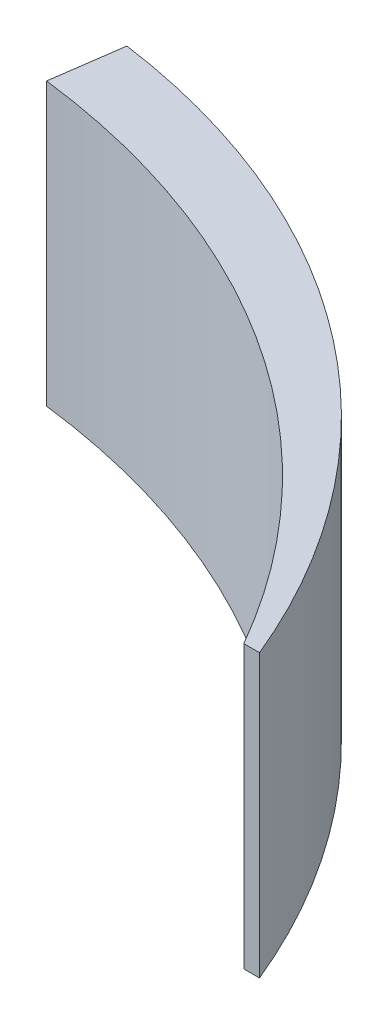
ISO-10303-21;
HEADER;
FILE_DESCRIPTION(('STEP AP214'),'2;1');
FILE_NAME('part.step','',(''),(''),'','','');
FILE_SCHEMA(('AUTOMOTIVE_DESIGN { 1 0 10303 214 1 1 1 1 }'));
ENDSEC;
DATA;
#1=APPLICATION_CONTEXT('core data for automotive mechanical design processes');
#2=APPLICATION_PROTOCOL_DEFINITION('international standard','automotive_design',2000,#1);
#3=PRODUCT_CONTEXT('',#1,'mechanical');
#4=PRODUCT('Part','Part','',(#3));
#5=PRODUCT_RELATED_PRODUCT_CATEGORY('part','',(#4));
#6=PRODUCT_DEFINITION_FORMATION('','',#4);
#7=PRODUCT_DEFINITION_CONTEXT('part definition',#1,'design');
#8=PRODUCT_DEFINITION('design','',#6,#7);
#9=PRODUCT_DEFINITION_SHAPE('','',#8);
#10=(LENGTH_UNIT() NAMED_UNIT(*) SI_UNIT(.MILLI.,.METRE.));
#11=(NAMED_UNIT(*) PLANE_ANGLE_UNIT() SI_UNIT($,.RADIAN.));
#12=(NAMED_UNIT(*) SI_UNIT($,.STERADIAN.) SOLID_ANGLE_UNIT());
#13=UNCERTAINTY_MEASURE_WITH_UNIT(LENGTH_MEASURE(1.E-05),#10,'distance_accuracy_value','');
#14=(GEOMETRIC_REPRESENTATION_CONTEXT(3) GLOBAL_UNCERTAINTY_ASSIGNED_CONTEXT((#13)) GLOBAL_UNIT_ASSIGNED_CONTEXT((#10,
#11,#12)) REPRESENTATION_CONTEXT('',''));
#15=CARTESIAN_POINT('',(0.,0.,0.));
#16=DIRECTION('',(0.,0.,1.));
#17=DIRECTION('',(1.,0.,0.));
#18=AXIS2_PLACEMENT_3D('',#15,#16,#17);
#19=CARTESIAN_POINT('',(146.569723697209,0.,20.5990313105062));
#20=DIRECTION('',(0.990268068741569,0.,0.139173100960076));
#21=DIRECTION('',(0.139173100960076,0.,-0.990268068741569));
#22=AXIS2_PLACEMENT_3D('',#19,#20,#21);
#23=PLANE('',#22);
#24=DIRECTION('',(0.,-1.,0.));
#25=VECTOR('',#24,1.);
#26=CARTESIAN_POINT('',(162.55301147089,57.15,-93.1279705784924));
#27=LINE('',#26,#25);
#28=CARTESIAN_POINT('',(162.55301147089,0.,-93.1279705784924));
#29=VERTEX_POINT('',#28);
#30=CARTESIAN_POINT('',(162.55301147089,57.15,-93.1279705784924));
#31=VERTEX_POINT('',#30);
#32=EDGE_CURVE('E42',#29,#31,#27,.F.);
#33=ORIENTED_EDGE('',*,*,#32,.F.);
#34=DIRECTION('',(-0.139173100960076,0.,0.990268068741569));
#35=VECTOR('',#34,1.);
#36=CARTESIAN_POINT('',(141.2875,0.,58.1840058724832));
#37=LINE('',#36,#35);
#38=CARTESIAN_POINT('',(160.545112701114,0.,-78.8410284664147));
#39=VERTEX_POINT('',#38);
#40=EDGE_CURVE('E11',#29,#39,#37,.T.);
#41=ORIENTED_EDGE('',*,*,#40,.T.);
#42=DIRECTION('',(0.,-1.,0.));
#43=VECTOR('',#42,1.);
#44=CARTESIAN_POINT('',(160.545112701114,57.15,-78.8410284664147));
#45=LINE('',#44,#43);
#46=CARTESIAN_POINT('',(160.545112701114,57.15,-78.8410284664147));
#47=VERTEX_POINT('',#46);
#48=EDGE_CURVE('E50',#47,#39,#45,.T.);
#49=ORIENTED_EDGE('',*,*,#48,.F.);
#50=DIRECTION('',(-0.139173100960076,0.,0.990268068741569));
#51=VECTOR('',#50,1.);
#52=CARTESIAN_POINT('',(141.2875,57.15,58.1840058724832));
#53=LINE('',#52,#51);
#54=EDGE_CURVE('E37',#31,#47,#53,.T.);
#55=ORIENTED_EDGE('',*,*,#54,.F.);
#56=EDGE_LOOP('',(#33,#41,#49,#55));
#57=FACE_BOUND('',#56,.T.);
#58=ADVANCED_FACE('F34',(#57),#23,.F.);
#59=CARTESIAN_POINT('',(141.2875,57.15,58.1840058724832));
#60=DIRECTION('',(0.,-1.,0.));
#61=DIRECTION('',(0.,0.,-1.));
#62=AXIS2_PLACEMENT_3D('',#59,#60,#61);
#63=CYLINDRICAL_SURFACE('',#62,152.799005872483);
#64=CARTESIAN_POINT('',(141.2875,0.,58.1840058724832));
#65=DIRECTION('',(0.,1.,0.));
#66=DIRECTION('',(0.,0.,-1.));
#67=AXIS2_PLACEMENT_3D('',#64,#65,#66);
#68=CIRCLE('',#67,152.799005872483);
#69=CARTESIAN_POINT('',(282.575,0.,0.));
#70=VERTEX_POINT('',#69);
#71=EDGE_CURVE('E98',#70,#29,#68,.T.);
#72=ORIENTED_EDGE('',*,*,#71,.T.);
#73=ORIENTED_EDGE('',*,*,#32,.T.);
#74=CARTESIAN_POINT('',(141.2875,57.15,58.1840058724832));
#75=DIRECTION('',(0.,1.,0.));
#76=DIRECTION('',(0.,0.,-1.));
#77=AXIS2_PLACEMENT_3D('',#74,#75,#76);
#78=CIRCLE('',#77,152.799005872483);
#79=CARTESIAN_POINT('',(282.575,57.15,0.));
#80=VERTEX_POINT('',#79);
#81=EDGE_CURVE('E81',#80,#31,#78,.T.);
#82=ORIENTED_EDGE('',*,*,#81,.F.);
#83=DIRECTION('',(0.,-1.,0.));
#84=VECTOR('',#83,1.);
#85=CARTESIAN_POINT('',(282.575,57.15,0.));
#86=LINE('',#85,#84);
#87=EDGE_CURVE('E89',#80,#70,#86,.T.);
#88=ORIENTED_EDGE('',*,*,#87,.T.);
#89=EDGE_LOOP('',(#72,#73,#82,#88));
#90=FACE_BOUND('',#89,.T.);
#91=ADVANCED_FACE('F106',(#90),#63,.T.);
#92=CARTESIAN_POINT('',(141.2875,57.15,79.1992410714286));
#93=DIRECTION('',(0.,-1.,0.));
#94=DIRECTION('',(0.,0.,-1.));
#95=AXIS2_PLACEMENT_3D('',#92,#93,#94);
#96=CYLINDRICAL_SURFACE('',#95,159.209241071429);
#97=CARTESIAN_POINT('',(141.2875,57.15,79.1992410714286));
#98=DIRECTION('',(0.,-1.,0.));
#99=DIRECTION('',(0.,0.,-1.));
#100=AXIS2_PLACEMENT_3D('',#97,#98,#99);
#101=CIRCLE('',#100,159.209241071429);
#102=CARTESIAN_POINT('',(279.4,57.15,0.));
#103=VERTEX_POINT('',#102);
#104=EDGE_CURVE('E74',#47,#103,#101,.T.);
#105=ORIENTED_EDGE('',*,*,#104,.F.);
#106=ORIENTED_EDGE('',*,*,#48,.T.);
#107=CARTESIAN_POINT('',(141.2875,0.,79.1992410714286));
#108=DIRECTION('',(0.,-1.,0.));
#109=DIRECTION('',(0.,0.,-1.));
#110=AXIS2_PLACEMENT_3D('',#107,#108,#109);
#111=CIRCLE('',#110,159.209241071429);
#112=CARTESIAN_POINT('',(279.4,0.,0.));
#113=VERTEX_POINT('',#112);
#114=EDGE_CURVE('E86',#39,#113,#111,.T.);
#115=ORIENTED_EDGE('',*,*,#114,.T.);
#116=DIRECTION('',(0.,-1.,0.));
#117=VECTOR('',#116,1.);
#118=CARTESIAN_POINT('',(279.4,57.15,0.));
#119=LINE('',#118,#117);
#120=EDGE_CURVE('E84',#103,#113,#119,.T.);
#121=ORIENTED_EDGE('',*,*,#120,.F.);
#122=EDGE_LOOP('',(#105,#106,#115,#121));
#123=FACE_BOUND('',#122,.T.);
#124=ADVANCED_FACE('F85',(#123),#96,.F.);
#125=CARTESIAN_POINT('',(141.2875,57.15,58.1840058724832));
#126=DIRECTION('',(0.,-1.,0.));
#127=DIRECTION('',(0.,0.,-1.));
#128=AXIS2_PLACEMENT_3D('',#125,#126,#127);
#129=PLANE('',#128);
#130=ORIENTED_EDGE('',*,*,#81,.T.);
#131=ORIENTED_EDGE('',*,*,#54,.T.);
#132=ORIENTED_EDGE('',*,*,#104,.T.);
#133=DIRECTION('',(1.,0.,0.));
#134=VECTOR('',#133,1.);
#135=CARTESIAN_POINT('',(279.4,57.15,0.));
#136=LINE('',#135,#134);
#137=EDGE_CURVE('E79',#103,#80,#136,.T.);
#138=ORIENTED_EDGE('',*,*,#137,.T.);
#139=EDGE_LOOP('',(#130,#131,#132,#138));
#140=FACE_BOUND('',#139,.T.);
#141=ADVANCED_FACE('F77',(#140),#129,.F.);
#142=CARTESIAN_POINT('',(141.2875,0.,58.1840058724832));
#143=DIRECTION('',(0.,-1.,0.));
#144=DIRECTION('',(0.,0.,-1.));
#145=AXIS2_PLACEMENT_3D('',#142,#143,#144);
#146=PLANE('',#145);
#147=ORIENTED_EDGE('',*,*,#40,.F.);
#148=ORIENTED_EDGE('',*,*,#71,.F.);
#149=DIRECTION('',(1.,0.,0.));
#150=VECTOR('',#149,1.);
#151=CARTESIAN_POINT('',(279.4,0.,0.));
#152=LINE('',#151,#150);
#153=EDGE_CURVE('E102',#113,#70,#152,.T.);
#154=ORIENTED_EDGE('',*,*,#153,.F.);
#155=ORIENTED_EDGE('',*,*,#114,.F.);
#156=EDGE_LOOP('',(#147,#148,#154,#155));
#157=FACE_BOUND('',#156,.T.);
#158=ADVANCED_FACE('F108',(#157),#146,.T.);
#159=CARTESIAN_POINT('',(279.4,57.15,0.));
#160=DIRECTION('',(0.,0.,-1.));
#161=DIRECTION('',(-1.,0.,0.));
#162=AXIS2_PLACEMENT_3D('',#159,#160,#161);
#163=PLANE('',#162);
#164=ORIENTED_EDGE('',*,*,#153,.T.);
#165=ORIENTED_EDGE('',*,*,#87,.F.);
#166=ORIENTED_EDGE('',*,*,#137,.F.);
#167=ORIENTED_EDGE('',*,*,#120,.T.);
#168=EDGE_LOOP('',(#164,#165,#166,#167));
#169=FACE_BOUND('',#168,.T.);
#170=ADVANCED_FACE('F91',(#169),#163,.F.);
#171=CLOSED_SHELL('',(#58,#91,#124,#141,#158,#170));
#172=MANIFOLD_SOLID_BREP('B2',#171);
#173=ADVANCED_BREP_SHAPE_REPRESENTATION('',(#18,#172),#14);
#174=SHAPE_DEFINITION_REPRESENTATION(#9,#173);
ENDSEC;
END-ISO-10303-21;
